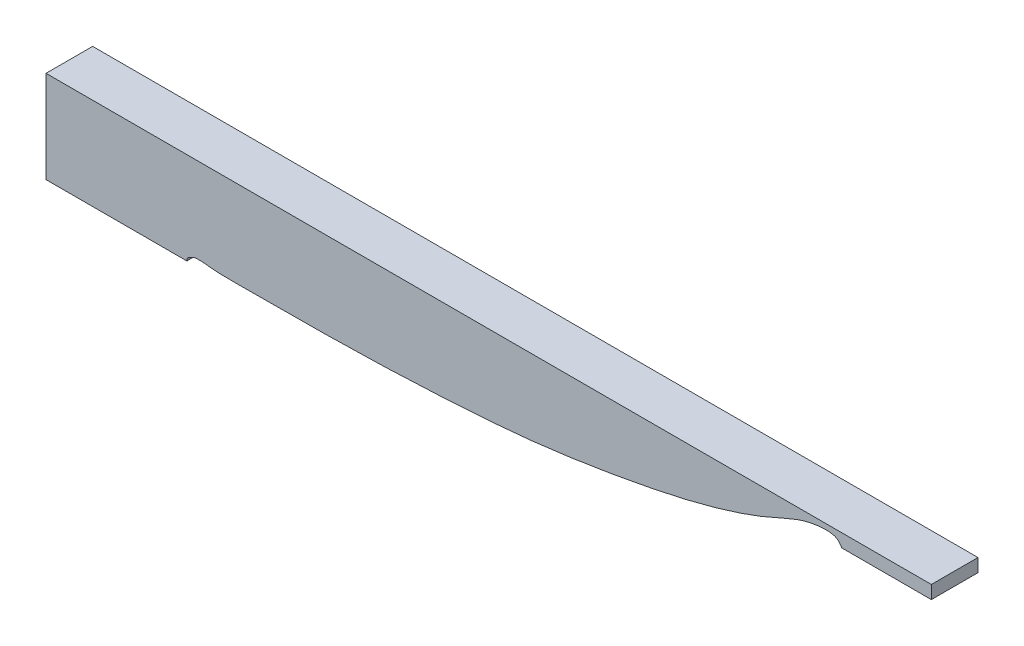
ISO-10303-21;
HEADER;
FILE_DESCRIPTION(('STEP AP214'),'2;1');
FILE_NAME('part.step','',(''),(''),'','','');
FILE_SCHEMA(('AUTOMOTIVE_DESIGN { 1 0 10303 214 1 1 1 1 }'));
ENDSEC;
DATA;
#1=APPLICATION_CONTEXT('core data for automotive mechanical design processes');
#2=APPLICATION_PROTOCOL_DEFINITION('international standard','automotive_design',2000,#1);
#3=PRODUCT_CONTEXT('',#1,'mechanical');
#4=PRODUCT('Part','Part','',(#3));
#5=PRODUCT_RELATED_PRODUCT_CATEGORY('part','',(#4));
#6=PRODUCT_DEFINITION_FORMATION('','',#4);
#7=PRODUCT_DEFINITION_CONTEXT('part definition',#1,'design');
#8=PRODUCT_DEFINITION('design','',#6,#7);
#9=PRODUCT_DEFINITION_SHAPE('','',#8);
#10=(LENGTH_UNIT() NAMED_UNIT(*) SI_UNIT(.MILLI.,.METRE.));
#11=(NAMED_UNIT(*) PLANE_ANGLE_UNIT() SI_UNIT($,.RADIAN.));
#12=(NAMED_UNIT(*) SI_UNIT($,.STERADIAN.) SOLID_ANGLE_UNIT());
#13=UNCERTAINTY_MEASURE_WITH_UNIT(LENGTH_MEASURE(1.E-05),#10,'distance_accuracy_value','');
#14=(GEOMETRIC_REPRESENTATION_CONTEXT(3) GLOBAL_UNCERTAINTY_ASSIGNED_CONTEXT((#13)) GLOBAL_UNIT_ASSIGNED_CONTEXT((#10,
#11,#12)) REPRESENTATION_CONTEXT('',''));
#15=CARTESIAN_POINT('',(0.,0.,0.));
#16=DIRECTION('',(0.,0.,1.));
#17=DIRECTION('',(1.,0.,0.));
#18=AXIS2_PLACEMENT_3D('',#15,#16,#17);
#19=CARTESIAN_POINT('',(-61.1097632450911,-13.5381187247569,444.));
#20=CARTESIAN_POINT('',(-61.1174432739635,-13.4632342528779,444.));
#21=CARTESIAN_POINT('',(-61.1238122177687,-13.3869369096974,444.));
#22=CARTESIAN_POINT('',(-61.1058844945308,-13.2374141198045,444.));
#23=CARTESIAN_POINT('',(-61.0814744709307,-13.1640073104843,444.));
#24=CARTESIAN_POINT('',(-61.0038170546127,-13.0359343061188,444.));
#25=CARTESIAN_POINT('',(-60.9477969179691,-12.9824575028687,444.));
#26=CARTESIAN_POINT('',(-60.8262749554456,-12.8926392979678,444.));
#27=CARTESIAN_POINT('',(-60.7624197969776,-12.8515369093078,444.));
#28=CARTESIAN_POINT('',(-60.5725982487433,-12.7268386809533,444.));
#29=CARTESIAN_POINT('',(-60.4419717093001,-12.6492028681605,444.));
#30=CARTESIAN_POINT('',(-60.1716618686996,-12.5149439689396,444.));
#31=CARTESIAN_POINT('',(-60.029406470997,-12.4598904396667,444.));
#32=CARTESIAN_POINT('',(-59.5920482746421,-12.3443128087331,444.));
#33=CARTESIAN_POINT('',(-59.2952677136872,-12.3252891334381,444.));
#34=CARTESIAN_POINT('',(-58.6979707557727,-12.328863419958,444.));
#35=CARTESIAN_POINT('',(-58.3979567566348,-12.3513050217166,444.));
#36=CARTESIAN_POINT('',(-57.8014938687845,-12.4100227543964,444.));
#37=CARTESIAN_POINT('',(-57.5038929420083,-12.4464247469973,444.));
#38=CARTESIAN_POINT('',(-56.9075990390787,-12.5070301081657,444.));
#39=CARTESIAN_POINT('',(-56.6089484932807,-12.5317074406057,444.));
#40=CARTESIAN_POINT('',(-55.711750742071,-12.5918198530944,444.));
#41=CARTESIAN_POINT('',(-55.1132803650667,-12.612676608153,444.));
#42=CARTESIAN_POINT('',(-53.9163877736803,-12.6310406811726,444.));
#43=CARTESIAN_POINT('',(-53.317884930617,-12.6317600675335,444.));
#44=CARTESIAN_POINT('',(-52.1208745614975,-12.6324980025269,444.));
#45=CARTESIAN_POINT('',(-51.5223702640213,-12.632999727358,444.));
#46=CARTESIAN_POINT('',(-49.7268349127535,-12.6311438030309,444.));
#47=CARTESIAN_POINT('',(-48.5297813137773,-12.6254121329417,444.));
#48=CARTESIAN_POINT('',(-44.9386094340265,-12.6065585124699,444.));
#49=CARTESIAN_POINT('',(-42.544498119583,-12.5909000300426,444.));
#50=CARTESIAN_POINT('',(-37.7564147408293,-12.5447817594,444.));
#51=CARTESIAN_POINT('',(-35.3623476807366,-12.5128527671942,444.));
#52=CARTESIAN_POINT('',(-30.57553359105,-12.4112492898615,444.));
#53=CARTESIAN_POINT('',(-28.182805378025,-12.3415843402945,444.));
#54=CARTESIAN_POINT('',(-23.3988028212542,-12.1618546807248,444.));
#55=CARTESIAN_POINT('',(-21.0075112110707,-12.0522697662292,444.));
#56=CARTESIAN_POINT('',(-16.2260605783114,-11.8016278725348,444.));
#57=CARTESIAN_POINT('',(-13.836039091371,-11.6614314131437,444.));
#58=CARTESIAN_POINT('',(-9.06064777718235,-11.3314218610187,444.));
#59=CARTESIAN_POINT('',(-6.67517872179077,-11.1401048582237,444.));
#60=CARTESIAN_POINT('',(-1.91120571709136,-10.6751627100215,444.));
#61=CARTESIAN_POINT('',(0.467935302154869,-10.3999301453364,444.));
#62=CARTESIAN_POINT('',(5.21507863296527,-9.7641345644879,444.));
#63=CARTESIAN_POINT('',(7.58285429424933,-9.40672131291314,444.));
#64=CARTESIAN_POINT('',(12.3094715695138,-8.630985087864,444.));
#65=CARTESIAN_POINT('',(14.6674782861062,-8.21307461563359,444.));
#66=CARTESIAN_POINT('',(19.3697199741792,-7.3036719617278,444.));
#67=CARTESIAN_POINT('',(21.714727475058,-6.81364984152556,444.));
#68=CARTESIAN_POINT('',(25.2073566023502,-5.99634467124267,444.));
#69=CARTESIAN_POINT('',(26.3674884799407,-5.70932881817541,444.));
#70=CARTESIAN_POINT('',(28.677217991639,-5.09763060762331,444.));
#71=CARTESIAN_POINT('',(29.8266762889707,-4.77245003407822,444.));
#72=CARTESIAN_POINT('',(32.1147830153033,-4.08343685147181,444.));
#73=CARTESIAN_POINT('',(33.2536995584232,-3.72056291795914,444.));
#74=CARTESIAN_POINT('',(35.5172410681443,-2.94371373255702,444.));
#75=CARTESIAN_POINT('',(36.6424898363715,-2.52903222930771,444.));
#76=CARTESIAN_POINT('',(38.3116245347812,-1.85036914408325,444.));
#77=CARTESIAN_POINT('',(38.8645799074946,-1.61483082686101,444.));
#78=CARTESIAN_POINT('',(39.9667527137753,-1.13357923414133,444.));
#79=CARTESIAN_POINT('',(40.5154730291312,-0.886512764581455,444.));
#80=CARTESIAN_POINT('',(42.1640701566691,-0.151944829513684,444.));
#81=CARTESIAN_POINT('',(43.2676222069748,0.325552354732076,444.));
#82=CARTESIAN_POINT('',(44.9915116182074,0.855168894107161,444.));
#83=CARTESIAN_POINT('',(45.5781752826903,0.99895064471253,444.));
#84=CARTESIAN_POINT('',(46.4773129628708,1.16251677280402,444.));
#85=CARTESIAN_POINT('',(46.7811203156214,1.20871988927979,444.));
#86=CARTESIAN_POINT('',(47.3886288380512,1.28148939560307,444.));
#87=CARTESIAN_POINT('',(47.6926837527682,1.3078888074103,444.));
#88=CARTESIAN_POINT('',(48.3014652217791,1.33838105419843,444.));
#89=CARTESIAN_POINT('',(48.6061744483362,1.34304938012017,444.));
#90=CARTESIAN_POINT('',(49.0642610262736,1.31608456447912,444.));
#91=CARTESIAN_POINT('',(49.2171241063057,1.30153146663678,444.));
#92=CARTESIAN_POINT('',(49.5232505538435,1.25913087379488,444.));
#93=CARTESIAN_POINT('',(49.6748788634548,1.23093376861252,444.));
#94=CARTESIAN_POINT('',(49.9709568660018,1.14976723235744,444.));
#95=CARTESIAN_POINT('',(50.1177626621305,1.09528874452211,444.));
#96=CARTESIAN_POINT('',(50.3872621360771,0.945206713841565,444.));
#97=CARTESIAN_POINT('',(50.5060650552743,0.847947870354981,444.));
#98=CARTESIAN_POINT('',(50.725047813279,0.627843159250472,444.));
#99=CARTESIAN_POINT('',(50.8221124166616,0.507247332791472,444.));
#100=CARTESIAN_POINT('',(50.9733998328543,0.331181694958353,444.));
#101=CARTESIAN_POINT('',(51.0241129154408,0.27273406056431,444.));
#102=CARTESIAN_POINT('',(51.1142120162352,0.146228368494598,444.));
#103=CARTESIAN_POINT('',(51.151099617505,0.0771184085545751,444.));
#104=CARTESIAN_POINT('',(51.1654699704875,-1.12269134960874E-13,444.));
#105=B_SPLINE_CURVE_WITH_KNOTS('',3,(#19,#20,#21,#22,#23,#24,#25,#26,#27,#28,#29,#30,#31,#32,
#33,#34,#35,#36,#37,#38,#39,#40,#41,#42,#43,#44,#45,#46,#47,#48,#49,#50,#51,#52,#53,#54,#55,#56,
#57,#58,#59,#60,#61,#62,#63,#64,#65,#66,#67,#68,#69,#70,#71,#72,#73,#74,#75,#76,#77,#78,#79,#80,
#81,#82,#83,#84,#85,#86,#87,#88,#89,#90,#91,#92,#93,#94,#95,#96,#97,#98,#99,#100,#101,#102,#103,
#104),.UNSPECIFIED.,.F.,.F.,(4,2,2,2,2,2,2,2,2,2,2,2,2,2,2,2,2,2,2,2,2,2,2,2,2,2,2,2,2,2,2,2,2,
2,2,2,2,2,2,2,2,2,4),(0.,0.00195312500000011,0.00390625000000011,0.00585937500000011,
0.00781250000000011,0.0117187500000002,0.0156250000000003,0.0234375000000004,0.0312500000000006,
0.0390625000000006,0.0468750000000007,0.0625000000000008,0.0781250000000009,0.093750000000001,
0.125000000000001,0.187500000000001,0.250000000000001,0.312500000000001,0.375000000000001,
0.437500000000001,0.500000000000001,0.562500000000001,0.625000000000001,0.687500000000001,
0.750000000000001,0.781250000000001,0.812500000000001,0.843750000000001,0.875000000000001,
0.890625000000001,0.90625,0.9375,0.953125,0.9609375,0.96875,0.9765625,0.98046875,0.984375,
0.98828125,0.9921875,0.99609375,0.998046875,1.),.UNSPECIFIED.);
#106=DIRECTION('',(0.,0.,-1.));
#107=VECTOR('',#106,1.);
#108=SURFACE_OF_LINEAR_EXTRUSION('',#105,#107);
#109=CARTESIAN_POINT('',(-61.1097632450911,-13.5381187247569,436.));
#110=CARTESIAN_POINT('',(-61.1174432739635,-13.4632342528779,436.));
#111=CARTESIAN_POINT('',(-61.1238122177687,-13.3869369096974,436.));
#112=CARTESIAN_POINT('',(-61.1058844945308,-13.2374141198045,436.));
#113=CARTESIAN_POINT('',(-61.0814744709307,-13.1640073104843,436.));
#114=CARTESIAN_POINT('',(-61.0038170546127,-13.0359343061188,436.));
#115=CARTESIAN_POINT('',(-60.9477969179691,-12.9824575028687,436.));
#116=CARTESIAN_POINT('',(-60.8262749554456,-12.8926392979678,436.));
#117=CARTESIAN_POINT('',(-60.7624197969776,-12.8515369093078,436.));
#118=CARTESIAN_POINT('',(-60.5725982487433,-12.7268386809533,436.));
#119=CARTESIAN_POINT('',(-60.4419717093001,-12.6492028681605,436.));
#120=CARTESIAN_POINT('',(-60.1716618686996,-12.5149439689396,436.));
#121=CARTESIAN_POINT('',(-60.029406470997,-12.4598904396667,436.));
#122=CARTESIAN_POINT('',(-59.5920482746421,-12.3443128087331,436.));
#123=CARTESIAN_POINT('',(-59.2952677136872,-12.3252891334381,436.));
#124=CARTESIAN_POINT('',(-58.6979707557727,-12.328863419958,436.));
#125=CARTESIAN_POINT('',(-58.3979567566348,-12.3513050217166,436.));
#126=CARTESIAN_POINT('',(-57.8014938687845,-12.4100227543964,436.));
#127=CARTESIAN_POINT('',(-57.5038929420083,-12.4464247469973,436.));
#128=CARTESIAN_POINT('',(-56.9075990390787,-12.5070301081657,436.));
#129=CARTESIAN_POINT('',(-56.6089484932807,-12.5317074406057,436.));
#130=CARTESIAN_POINT('',(-55.711750742071,-12.5918198530944,436.));
#131=CARTESIAN_POINT('',(-55.1132803650667,-12.612676608153,436.));
#132=CARTESIAN_POINT('',(-53.9163877736803,-12.6310406811726,436.));
#133=CARTESIAN_POINT('',(-53.317884930617,-12.6317600675335,436.));
#134=CARTESIAN_POINT('',(-52.1208745614975,-12.6324980025269,436.));
#135=CARTESIAN_POINT('',(-51.5223702640213,-12.632999727358,436.));
#136=CARTESIAN_POINT('',(-49.7268349127535,-12.6311438030309,436.));
#137=CARTESIAN_POINT('',(-48.5297813137773,-12.6254121329417,436.));
#138=CARTESIAN_POINT('',(-44.9386094340265,-12.6065585124699,436.));
#139=CARTESIAN_POINT('',(-42.544498119583,-12.5909000300426,436.));
#140=CARTESIAN_POINT('',(-37.7564147408293,-12.5447817594,436.));
#141=CARTESIAN_POINT('',(-35.3623476807366,-12.5128527671942,436.));
#142=CARTESIAN_POINT('',(-30.57553359105,-12.4112492898615,436.));
#143=CARTESIAN_POINT('',(-28.182805378025,-12.3415843402945,436.));
#144=CARTESIAN_POINT('',(-23.3988028212542,-12.1618546807248,436.));
#145=CARTESIAN_POINT('',(-21.0075112110707,-12.0522697662292,436.));
#146=CARTESIAN_POINT('',(-16.2260605783114,-11.8016278725348,436.));
#147=CARTESIAN_POINT('',(-13.836039091371,-11.6614314131437,436.));
#148=CARTESIAN_POINT('',(-9.06064777718235,-11.3314218610187,436.));
#149=CARTESIAN_POINT('',(-6.67517872179077,-11.1401048582237,436.));
#150=CARTESIAN_POINT('',(-1.91120571709136,-10.6751627100215,436.));
#151=CARTESIAN_POINT('',(0.467935302154869,-10.3999301453364,436.));
#152=CARTESIAN_POINT('',(5.21507863296527,-9.7641345644879,436.));
#153=CARTESIAN_POINT('',(7.58285429424933,-9.40672131291314,436.));
#154=CARTESIAN_POINT('',(12.3094715695138,-8.630985087864,436.));
#155=CARTESIAN_POINT('',(14.6674782861062,-8.21307461563359,436.));
#156=CARTESIAN_POINT('',(19.3697199741792,-7.3036719617278,436.));
#157=CARTESIAN_POINT('',(21.714727475058,-6.81364984152556,436.));
#158=CARTESIAN_POINT('',(25.2073566023502,-5.99634467124267,436.));
#159=CARTESIAN_POINT('',(26.3674884799407,-5.70932881817541,436.));
#160=CARTESIAN_POINT('',(28.677217991639,-5.09763060762331,436.));
#161=CARTESIAN_POINT('',(29.8266762889707,-4.77245003407822,436.));
#162=CARTESIAN_POINT('',(32.1147830153033,-4.08343685147181,436.));
#163=CARTESIAN_POINT('',(33.2536995584232,-3.72056291795914,436.));
#164=CARTESIAN_POINT('',(35.5172410681443,-2.94371373255702,436.));
#165=CARTESIAN_POINT('',(36.6424898363715,-2.52903222930771,436.));
#166=CARTESIAN_POINT('',(38.3116245347812,-1.85036914408325,436.));
#167=CARTESIAN_POINT('',(38.8645799074946,-1.61483082686101,436.));
#168=CARTESIAN_POINT('',(39.9667527137753,-1.13357923414133,436.));
#169=CARTESIAN_POINT('',(40.5154730291312,-0.886512764581455,436.));
#170=CARTESIAN_POINT('',(42.1640701566691,-0.151944829513684,436.));
#171=CARTESIAN_POINT('',(43.2676222069748,0.325552354732076,436.));
#172=CARTESIAN_POINT('',(44.9915116182074,0.855168894107161,436.));
#173=CARTESIAN_POINT('',(45.5781752826903,0.99895064471253,436.));
#174=CARTESIAN_POINT('',(46.4773129628708,1.16251677280402,436.));
#175=CARTESIAN_POINT('',(46.7811203156214,1.20871988927979,436.));
#176=CARTESIAN_POINT('',(47.3886288380512,1.28148939560307,436.));
#177=CARTESIAN_POINT('',(47.6926837527682,1.3078888074103,436.));
#178=CARTESIAN_POINT('',(48.3014652217791,1.33838105419843,436.));
#179=CARTESIAN_POINT('',(48.6061744483362,1.34304938012017,436.));
#180=CARTESIAN_POINT('',(49.0642610262736,1.31608456447912,436.));
#181=CARTESIAN_POINT('',(49.2171241063057,1.30153146663678,436.));
#182=CARTESIAN_POINT('',(49.5232505538435,1.25913087379488,436.));
#183=CARTESIAN_POINT('',(49.6748788634548,1.23093376861252,436.));
#184=CARTESIAN_POINT('',(49.9709568660018,1.14976723235744,436.));
#185=CARTESIAN_POINT('',(50.1177626621305,1.09528874452211,436.));
#186=CARTESIAN_POINT('',(50.3872621360771,0.945206713841565,436.));
#187=CARTESIAN_POINT('',(50.5060650552743,0.847947870354981,436.));
#188=CARTESIAN_POINT('',(50.725047813279,0.627843159250472,436.));
#189=CARTESIAN_POINT('',(50.8221124166616,0.507247332791472,436.));
#190=CARTESIAN_POINT('',(50.9733998328543,0.331181694958353,436.));
#191=CARTESIAN_POINT('',(51.0241129154408,0.27273406056431,436.));
#192=CARTESIAN_POINT('',(51.1142120162352,0.146228368494598,436.));
#193=CARTESIAN_POINT('',(51.151099617505,0.0771184085545751,436.));
#194=CARTESIAN_POINT('',(51.1654699704875,-1.12269134960874E-13,436.));
#195=B_SPLINE_CURVE_WITH_KNOTS('',3,(#109,#110,#111,#112,#113,#114,#115,#116,#117,#118,#119,
#120,#121,#122,#123,#124,#125,#126,#127,#128,#129,#130,#131,#132,#133,#134,#135,#136,#137,#138,
#139,#140,#141,#142,#143,#144,#145,#146,#147,#148,#149,#150,#151,#152,#153,#154,#155,#156,#157,
#158,#159,#160,#161,#162,#163,#164,#165,#166,#167,#168,#169,#170,#171,#172,#173,#174,#175,#176,
#177,#178,#179,#180,#181,#182,#183,#184,#185,#186,#187,#188,#189,#190,#191,#192,#193,#194),
.UNSPECIFIED.,.F.,.F.,(4,2,2,2,2,2,2,2,2,2,2,2,2,2,2,2,2,2,2,2,2,2,2,2,2,2,2,2,2,2,2,2,2,2,2,2,
2,2,2,2,2,2,4),(0.,0.00195312500000011,0.00390625000000011,0.00585937500000011,
0.00781250000000011,0.0117187500000002,0.0156250000000003,0.0234375000000004,0.0312500000000006,
0.0390625000000006,0.0468750000000007,0.0625000000000008,0.0781250000000009,0.093750000000001,
0.125000000000001,0.187500000000001,0.250000000000001,0.312500000000001,0.375000000000001,
0.437500000000001,0.500000000000001,0.562500000000001,0.625000000000001,0.687500000000001,
0.750000000000001,0.781250000000001,0.812500000000001,0.843750000000001,0.875000000000001,
0.890625000000001,0.90625,0.9375,0.953125,0.9609375,0.96875,0.9765625,0.98046875,0.984375,
0.98828125,0.9921875,0.99609375,0.998046875,1.),.UNSPECIFIED.);
#196=CARTESIAN_POINT('',(-61.109763245088,-13.5381187247565,436.));
#197=VERTEX_POINT('',#196);
#198=CARTESIAN_POINT('',(51.1654699704875,0.,436.));
#199=VERTEX_POINT('',#198);
#200=EDGE_CURVE('E165',#197,#199,#195,.T.);
#201=ORIENTED_EDGE('',*,*,#200,.T.);
#202=DIRECTION('',(0.,0.,-1.));
#203=VECTOR('',#202,1.);
#204=CARTESIAN_POINT('',(51.1654699704875,0.,444.));
#205=LINE('',#204,#203);
#206=CARTESIAN_POINT('',(51.1654699704875,0.,444.));
#207=VERTEX_POINT('',#206);
#208=EDGE_CURVE('E11',#207,#199,#205,.T.);
#209=ORIENTED_EDGE('',*,*,#208,.F.);
#210=CARTESIAN_POINT('',(51.1654699704875,-1.12269134960874E-13,444.));
#211=CARTESIAN_POINT('',(51.151099617505,0.0771184085545751,444.));
#212=CARTESIAN_POINT('',(51.1142120162352,0.146228368494598,444.));
#213=CARTESIAN_POINT('',(51.0241129154408,0.27273406056431,444.));
#214=CARTESIAN_POINT('',(50.9733998328543,0.331181694958353,444.));
#215=CARTESIAN_POINT('',(50.8221124166616,0.507247332791472,444.));
#216=CARTESIAN_POINT('',(50.725047813279,0.627843159250472,444.));
#217=CARTESIAN_POINT('',(50.5060650552743,0.847947870354981,444.));
#218=CARTESIAN_POINT('',(50.3872621360771,0.945206713841565,444.));
#219=CARTESIAN_POINT('',(50.1177626621305,1.09528874452211,444.));
#220=CARTESIAN_POINT('',(49.9709568660018,1.14976723235744,444.));
#221=CARTESIAN_POINT('',(49.6748788634548,1.23093376861252,444.));
#222=CARTESIAN_POINT('',(49.5232505538435,1.25913087379488,444.));
#223=CARTESIAN_POINT('',(49.2171241063057,1.30153146663678,444.));
#224=CARTESIAN_POINT('',(49.0642610262736,1.31608456447912,444.));
#225=CARTESIAN_POINT('',(48.6061744483362,1.34304938012017,444.));
#226=CARTESIAN_POINT('',(48.3014652217791,1.33838105419843,444.));
#227=CARTESIAN_POINT('',(47.6926837527682,1.3078888074103,444.));
#228=CARTESIAN_POINT('',(47.3886288380512,1.28148939560307,444.));
#229=CARTESIAN_POINT('',(46.7811203156214,1.20871988927979,444.));
#230=CARTESIAN_POINT('',(46.4773129628708,1.16251677280402,444.));
#231=CARTESIAN_POINT('',(45.5781752826903,0.99895064471253,444.));
#232=CARTESIAN_POINT('',(44.9915116182074,0.855168894107161,444.));
#233=CARTESIAN_POINT('',(43.2676222069748,0.325552354732076,444.));
#234=CARTESIAN_POINT('',(42.1640701566691,-0.151944829513684,444.));
#235=CARTESIAN_POINT('',(40.5154730291312,-0.886512764581455,444.));
#236=CARTESIAN_POINT('',(39.9667527137753,-1.13357923414133,444.));
#237=CARTESIAN_POINT('',(38.8645799074946,-1.61483082686101,444.));
#238=CARTESIAN_POINT('',(38.3116245347812,-1.85036914408325,444.));
#239=CARTESIAN_POINT('',(36.6424898363715,-2.52903222930771,444.));
#240=CARTESIAN_POINT('',(35.5172410681443,-2.94371373255702,444.));
#241=CARTESIAN_POINT('',(33.2536995584232,-3.72056291795914,444.));
#242=CARTESIAN_POINT('',(32.1147830153033,-4.08343685147181,444.));
#243=CARTESIAN_POINT('',(29.8266762889707,-4.77245003407822,444.));
#244=CARTESIAN_POINT('',(28.677217991639,-5.09763060762331,444.));
#245=CARTESIAN_POINT('',(26.3674884799407,-5.70932881817541,444.));
#246=CARTESIAN_POINT('',(25.2073566023502,-5.99634467124267,444.));
#247=CARTESIAN_POINT('',(21.714727475058,-6.81364984152556,444.));
#248=CARTESIAN_POINT('',(19.3697199741792,-7.3036719617278,444.));
#249=CARTESIAN_POINT('',(14.6674782861062,-8.21307461563359,444.));
#250=CARTESIAN_POINT('',(12.3094715695138,-8.630985087864,444.));
#251=CARTESIAN_POINT('',(7.58285429424933,-9.40672131291314,444.));
#252=CARTESIAN_POINT('',(5.21507863296527,-9.7641345644879,444.));
#253=CARTESIAN_POINT('',(0.467935302154869,-10.3999301453364,444.));
#254=CARTESIAN_POINT('',(-1.91120571709136,-10.6751627100215,444.));
#255=CARTESIAN_POINT('',(-6.67517872179077,-11.1401048582237,444.));
#256=CARTESIAN_POINT('',(-9.06064777718235,-11.3314218610187,444.));
#257=CARTESIAN_POINT('',(-13.836039091371,-11.6614314131437,444.));
#258=CARTESIAN_POINT('',(-16.2260605783114,-11.8016278725348,444.));
#259=CARTESIAN_POINT('',(-21.0075112110707,-12.0522697662292,444.));
#260=CARTESIAN_POINT('',(-23.3988028212542,-12.1618546807248,444.));
#261=CARTESIAN_POINT('',(-28.182805378025,-12.3415843402945,444.));
#262=CARTESIAN_POINT('',(-30.57553359105,-12.4112492898615,444.));
#263=CARTESIAN_POINT('',(-35.3623476807366,-12.5128527671942,444.));
#264=CARTESIAN_POINT('',(-37.7564147408293,-12.5447817594,444.));
#265=CARTESIAN_POINT('',(-42.544498119583,-12.5909000300426,444.));
#266=CARTESIAN_POINT('',(-44.9386094340265,-12.6065585124699,444.));
#267=CARTESIAN_POINT('',(-48.5297813137773,-12.6254121329417,444.));
#268=CARTESIAN_POINT('',(-49.7268349127535,-12.6311438030309,444.));
#269=CARTESIAN_POINT('',(-51.5223702640213,-12.632999727358,444.));
#270=CARTESIAN_POINT('',(-52.1208745614975,-12.6324980025269,444.));
#271=CARTESIAN_POINT('',(-53.317884930617,-12.6317600675335,444.));
#272=CARTESIAN_POINT('',(-53.9163877736803,-12.6310406811726,444.));
#273=CARTESIAN_POINT('',(-55.1132803650667,-12.612676608153,444.));
#274=CARTESIAN_POINT('',(-55.711750742071,-12.5918198530944,444.));
#275=CARTESIAN_POINT('',(-56.6089484932807,-12.5317074406057,444.));
#276=CARTESIAN_POINT('',(-56.9075990390787,-12.5070301081657,444.));
#277=CARTESIAN_POINT('',(-57.5038929420083,-12.4464247469973,444.));
#278=CARTESIAN_POINT('',(-57.8014938687845,-12.4100227543964,444.));
#279=CARTESIAN_POINT('',(-58.3979567566348,-12.3513050217166,444.));
#280=CARTESIAN_POINT('',(-58.6979707557727,-12.328863419958,444.));
#281=CARTESIAN_POINT('',(-59.2952677136872,-12.3252891334381,444.));
#282=CARTESIAN_POINT('',(-59.5920482746421,-12.3443128087331,444.));
#283=CARTESIAN_POINT('',(-60.029406470997,-12.4598904396667,444.));
#284=CARTESIAN_POINT('',(-60.1716618686996,-12.5149439689396,444.));
#285=CARTESIAN_POINT('',(-60.4419717093001,-12.6492028681605,444.));
#286=CARTESIAN_POINT('',(-60.5725982487433,-12.7268386809533,444.));
#287=CARTESIAN_POINT('',(-60.7624197969776,-12.8515369093078,444.));
#288=CARTESIAN_POINT('',(-60.8262749554456,-12.8926392979678,444.));
#289=CARTESIAN_POINT('',(-60.9477969179691,-12.9824575028687,444.));
#290=CARTESIAN_POINT('',(-61.0038170546127,-13.0359343061188,444.));
#291=CARTESIAN_POINT('',(-61.0814744709307,-13.1640073104843,444.));
#292=CARTESIAN_POINT('',(-61.1058844945308,-13.2374141198045,444.));
#293=CARTESIAN_POINT('',(-61.1238122177687,-13.3869369096974,444.));
#294=CARTESIAN_POINT('',(-61.1174432739635,-13.4632342528779,444.));
#295=CARTESIAN_POINT('',(-61.1097632450911,-13.5381187247569,444.));
#296=B_SPLINE_CURVE_WITH_KNOTS('',3,(#210,#211,#212,#213,#214,#215,#216,#217,#218,#219,#220,
#221,#222,#223,#224,#225,#226,#227,#228,#229,#230,#231,#232,#233,#234,#235,#236,#237,#238,#239,
#240,#241,#242,#243,#244,#245,#246,#247,#248,#249,#250,#251,#252,#253,#254,#255,#256,#257,#258,
#259,#260,#261,#262,#263,#264,#265,#266,#267,#268,#269,#270,#271,#272,#273,#274,#275,#276,#277,
#278,#279,#280,#281,#282,#283,#284,#285,#286,#287,#288,#289,#290,#291,#292,#293,#294,#295),
.UNSPECIFIED.,.F.,.F.,(4,2,2,2,2,2,2,2,2,2,2,2,2,2,2,2,2,2,2,2,2,2,2,2,2,2,2,2,2,2,2,2,2,2,2,2,
2,2,2,2,2,2,4),(0.,0.001953125,0.00390625,0.0078125,0.01171875,0.015625,0.01953125,0.0234375,
0.03125,0.0390625,0.046875,0.0624999999999998,0.0937499999999996,0.109374999999999,
0.124999999999999,0.156249999999999,0.187499999999999,0.218749999999999,0.249999999999999,
0.312499999999999,0.374999999999999,0.437499999999999,0.499999999999999,0.562499999999999,
0.624999999999999,0.687499999999999,0.749999999999999,0.812499999999999,0.874999999999999,
0.906249999999999,0.921874999999999,0.937499999999999,0.953124999999999,0.960937499999999,
0.968749999999999,0.9765625,0.984375,0.98828125,0.9921875,0.994140625,0.99609375,0.998046875,
1.),.UNSPECIFIED.);
#297=CARTESIAN_POINT('',(-61.109763245088,-13.5381187247565,444.));
#298=VERTEX_POINT('',#297);
#299=EDGE_CURVE('E129',#298,#207,#296,.F.);
#300=ORIENTED_EDGE('',*,*,#299,.F.);
#301=DIRECTION('',(0.,0.,-1.));
#302=VECTOR('',#301,1.);
#303=CARTESIAN_POINT('',(-61.109763245088,-13.5381187247565,444.));
#304=LINE('',#303,#302);
#305=EDGE_CURVE('E114',#298,#197,#304,.T.);
#306=ORIENTED_EDGE('',*,*,#305,.T.);
#307=EDGE_LOOP('',(#201,#209,#300,#306));
#308=FACE_BOUND('',#307,.T.);
#309=ADVANCED_FACE('F30',(#308),#108,.F.);
#310=CARTESIAN_POINT('',(51.1654699704875,0.,444.));
#311=DIRECTION('',(0.,1.,0.));
#312=DIRECTION('',(-1.,0.,0.));
#313=AXIS2_PLACEMENT_3D('',#310,#311,#312);
#314=PLANE('',#313);
#315=DIRECTION('',(1.,0.,0.));
#316=VECTOR('',#315,1.);
#317=CARTESIAN_POINT('',(51.1654699704875,0.,436.));
#318=LINE('',#317,#316);
#319=CARTESIAN_POINT('',(66.5509028648752,0.,436.));
#320=VERTEX_POINT('',#319);
#321=EDGE_CURVE('E120',#199,#320,#318,.T.);
#322=ORIENTED_EDGE('',*,*,#321,.T.);
#323=DIRECTION('',(0.,0.,-1.));
#324=VECTOR('',#323,1.);
#325=CARTESIAN_POINT('',(66.5509028648752,0.,444.));
#326=LINE('',#325,#324);
#327=CARTESIAN_POINT('',(66.5509028648752,0.,444.));
#328=VERTEX_POINT('',#327);
#329=EDGE_CURVE('E41',#328,#320,#326,.T.);
#330=ORIENTED_EDGE('',*,*,#329,.F.);
#331=DIRECTION('',(1.,0.,0.));
#332=VECTOR('',#331,1.);
#333=CARTESIAN_POINT('',(51.1654699704875,0.,444.));
#334=LINE('',#333,#332);
#335=EDGE_CURVE('E87',#207,#328,#334,.T.);
#336=ORIENTED_EDGE('',*,*,#335,.F.);
#337=ORIENTED_EDGE('',*,*,#208,.T.);
#338=EDGE_LOOP('',(#322,#330,#336,#337));
#339=FACE_BOUND('',#338,.T.);
#340=ADVANCED_FACE('F199',(#339),#314,.F.);
#341=CARTESIAN_POINT('',(66.5509028648752,2.25600000000005,444.));
#342=DIRECTION('',(-1.,0.,0.));
#343=DIRECTION('',(0.,0.,1.));
#344=AXIS2_PLACEMENT_3D('',#341,#342,#343);
#345=PLANE('',#344);
#346=DIRECTION('',(0.,1.,0.));
#347=VECTOR('',#346,1.);
#348=CARTESIAN_POINT('',(66.5509028648752,2.25600000000005,436.));
#349=LINE('',#348,#347);
#350=CARTESIAN_POINT('',(66.5509028648752,2.25600000000005,436.));
#351=VERTEX_POINT('',#350);
#352=EDGE_CURVE('E118',#320,#351,#349,.T.);
#353=ORIENTED_EDGE('',*,*,#352,.T.);
#354=DIRECTION('',(0.,0.,-1.));
#355=VECTOR('',#354,1.);
#356=CARTESIAN_POINT('',(66.5509028648752,2.25600000000005,444.));
#357=LINE('',#356,#355);
#358=CARTESIAN_POINT('',(66.5509028648752,2.25600000000005,444.));
#359=VERTEX_POINT('',#358);
#360=EDGE_CURVE('E109',#359,#351,#357,.T.);
#361=ORIENTED_EDGE('',*,*,#360,.F.);
#362=DIRECTION('',(0.,1.,0.));
#363=VECTOR('',#362,1.);
#364=CARTESIAN_POINT('',(66.5509028648752,2.25600000000005,444.));
#365=LINE('',#364,#363);
#366=EDGE_CURVE('E100',#328,#359,#365,.T.);
#367=ORIENTED_EDGE('',*,*,#366,.F.);
#368=ORIENTED_EDGE('',*,*,#329,.T.);
#369=EDGE_LOOP('',(#353,#361,#367,#368));
#370=FACE_BOUND('',#369,.T.);
#371=ADVANCED_FACE('F202',(#370),#345,.F.);
#372=CARTESIAN_POINT('',(66.5509028648752,2.25600000000005,444.));
#373=DIRECTION('',(0.,-1.,0.));
#374=DIRECTION('',(1.,0.,0.));
#375=AXIS2_PLACEMENT_3D('',#372,#373,#374);
#376=PLANE('',#375);
#377=DIRECTION('',(-1.,0.,0.));
#378=VECTOR('',#377,1.);
#379=CARTESIAN_POINT('',(66.5509028648752,2.25600000000005,436.));
#380=LINE('',#379,#378);
#381=CARTESIAN_POINT('',(-85.2665272595021,2.25600000000003,436.));
#382=VERTEX_POINT('',#381);
#383=EDGE_CURVE('E108',#351,#382,#380,.T.);
#384=ORIENTED_EDGE('',*,*,#383,.T.);
#385=DIRECTION('',(0.,0.,-1.));
#386=VECTOR('',#385,1.);
#387=CARTESIAN_POINT('',(-85.2665272595021,2.25600000000003,444.));
#388=LINE('',#387,#386);
#389=CARTESIAN_POINT('',(-85.2665272595021,2.25600000000003,444.));
#390=VERTEX_POINT('',#389);
#391=EDGE_CURVE('E105',#390,#382,#388,.T.);
#392=ORIENTED_EDGE('',*,*,#391,.F.);
#393=DIRECTION('',(-1.,0.,0.));
#394=VECTOR('',#393,1.);
#395=CARTESIAN_POINT('',(66.5509028648752,2.25600000000005,444.));
#396=LINE('',#395,#394);
#397=EDGE_CURVE('E94',#359,#390,#396,.T.);
#398=ORIENTED_EDGE('',*,*,#397,.F.);
#399=ORIENTED_EDGE('',*,*,#360,.T.);
#400=EDGE_LOOP('',(#384,#392,#398,#399));
#401=FACE_BOUND('',#400,.T.);
#402=ADVANCED_FACE('F106',(#401),#376,.F.);
#403=CARTESIAN_POINT('',(-85.2665272594999,-13.5381157451,444.));
#404=DIRECTION('',(1.,1.39708249391997E-13,0.));
#405=DIRECTION('',(-1.39708249391997E-13,1.,0.));
#406=AXIS2_PLACEMENT_3D('',#403,#404,#405);
#407=PLANE('',#406);
#408=DIRECTION('',(1.39708249391997E-13,-1.,0.));
#409=VECTOR('',#408,1.);
#410=CARTESIAN_POINT('',(-85.2665272594999,-13.5381157451,436.));
#411=LINE('',#410,#409);
#412=CARTESIAN_POINT('',(-85.2665272594999,-13.5381157451,436.));
#413=VERTEX_POINT('',#412);
#414=EDGE_CURVE('E73',#382,#413,#411,.T.);
#415=ORIENTED_EDGE('',*,*,#414,.T.);
#416=DIRECTION('',(0.,0.,-1.));
#417=VECTOR('',#416,1.);
#418=CARTESIAN_POINT('',(-85.2665272594999,-13.5381157451,444.));
#419=LINE('',#418,#417);
#420=CARTESIAN_POINT('',(-85.2665272594999,-13.5381157451,444.));
#421=VERTEX_POINT('',#420);
#422=EDGE_CURVE('E110',#421,#413,#419,.T.);
#423=ORIENTED_EDGE('',*,*,#422,.F.);
#424=DIRECTION('',(1.39708249391997E-13,-1.,0.));
#425=VECTOR('',#424,1.);
#426=CARTESIAN_POINT('',(-85.2665272594999,-13.5381157451,444.));
#427=LINE('',#426,#425);
#428=EDGE_CURVE('E98',#390,#421,#427,.T.);
#429=ORIENTED_EDGE('',*,*,#428,.F.);
#430=ORIENTED_EDGE('',*,*,#391,.T.);
#431=EDGE_LOOP('',(#415,#423,#429,#430));
#432=FACE_BOUND('',#431,.T.);
#433=ADVANCED_FACE('F112',(#432),#407,.F.);
#434=CARTESIAN_POINT('',(-85.2665272594999,-13.5381157451,444.));
#435=DIRECTION('',(1.23346675783537E-07,0.999999999999992,0.));
#436=DIRECTION('',(-0.999999999999992,1.23346675783537E-07,0.));
#437=AXIS2_PLACEMENT_3D('',#434,#435,#436);
#438=PLANE('',#437);
#439=DIRECTION('',(0.999999999999992,-1.23346675783537E-07,0.));
#440=VECTOR('',#439,1.);
#441=CARTESIAN_POINT('',(-85.2665272594999,-13.5381157451,436.));
#442=LINE('',#441,#440);
#443=EDGE_CURVE('E79',#413,#197,#442,.T.);
#444=ORIENTED_EDGE('',*,*,#443,.T.);
#445=ORIENTED_EDGE('',*,*,#305,.F.);
#446=DIRECTION('',(0.999999999999992,-1.23346675783537E-07,0.));
#447=VECTOR('',#446,1.);
#448=CARTESIAN_POINT('',(-85.2665272594999,-13.5381157451,444.));
#449=LINE('',#448,#447);
#450=EDGE_CURVE('E50',#421,#298,#449,.T.);
#451=ORIENTED_EDGE('',*,*,#450,.F.);
#452=ORIENTED_EDGE('',*,*,#422,.T.);
#453=EDGE_LOOP('',(#444,#445,#451,#452));
#454=FACE_BOUND('',#453,.T.);
#455=ADVANCED_FACE('F145',(#454),#438,.F.);
#456=CARTESIAN_POINT('',(-4.29319221944118,-10.9076337841226,444.));
#457=DIRECTION('',(0.,0.,-1.));
#458=DIRECTION('',(-1.,0.,0.));
#459=AXIS2_PLACEMENT_3D('',#456,#457,#458);
#460=PLANE('',#459);
#461=ORIENTED_EDGE('',*,*,#299,.T.);
#462=ORIENTED_EDGE('',*,*,#335,.T.);
#463=ORIENTED_EDGE('',*,*,#366,.T.);
#464=ORIENTED_EDGE('',*,*,#397,.T.);
#465=ORIENTED_EDGE('',*,*,#428,.T.);
#466=ORIENTED_EDGE('',*,*,#450,.T.);
#467=EDGE_LOOP('',(#461,#462,#463,#464,#465,#466));
#468=FACE_BOUND('',#467,.T.);
#469=ADVANCED_FACE('F96',(#468),#460,.F.);
#470=CARTESIAN_POINT('',(-4.29319221944118,-10.9076337841226,436.));
#471=DIRECTION('',(0.,0.,-1.));
#472=DIRECTION('',(-1.,0.,0.));
#473=AXIS2_PLACEMENT_3D('',#470,#471,#472);
#474=PLANE('',#473);
#475=ORIENTED_EDGE('',*,*,#200,.F.);
#476=ORIENTED_EDGE('',*,*,#443,.F.);
#477=ORIENTED_EDGE('',*,*,#414,.F.);
#478=ORIENTED_EDGE('',*,*,#383,.F.);
#479=ORIENTED_EDGE('',*,*,#352,.F.);
#480=ORIENTED_EDGE('',*,*,#321,.F.);
#481=EDGE_LOOP('',(#475,#476,#477,#478,#479,#480));
#482=FACE_BOUND('',#481,.T.);
#483=ADVANCED_FACE('F144',(#482),#474,.T.);
#484=CLOSED_SHELL('',(#309,#340,#371,#402,#433,#455,#469,#483));
#485=MANIFOLD_SOLID_BREP('B2',#484);
#486=ADVANCED_BREP_SHAPE_REPRESENTATION('',(#18,#485),#14);
#487=SHAPE_DEFINITION_REPRESENTATION(#9,#486);
ENDSEC;
END-ISO-10303-21;
